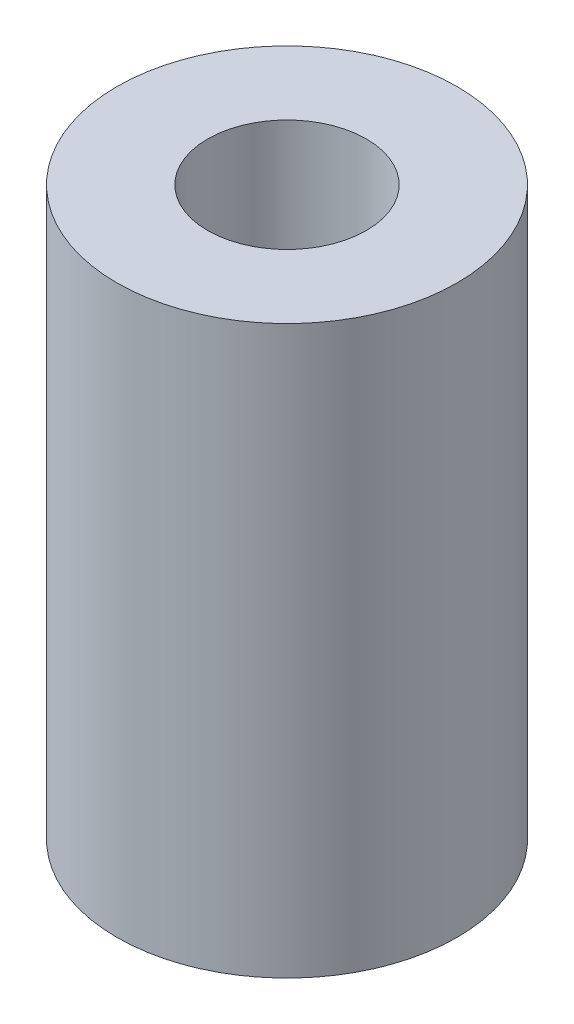
ISO-10303-21;
HEADER;
FILE_DESCRIPTION(('STEP AP214'),'2;1');
FILE_NAME('part.step','',(''),(''),'','','');
FILE_SCHEMA(('AUTOMOTIVE_DESIGN { 1 0 10303 214 1 1 1 1 }'));
ENDSEC;
DATA;
#1=APPLICATION_CONTEXT('core data for automotive mechanical design processes');
#2=APPLICATION_PROTOCOL_DEFINITION('international standard','automotive_design',2000,#1);
#3=PRODUCT_CONTEXT('',#1,'mechanical');
#4=PRODUCT('Part','Part','',(#3));
#5=PRODUCT_RELATED_PRODUCT_CATEGORY('part','',(#4));
#6=PRODUCT_DEFINITION_FORMATION('','',#4);
#7=PRODUCT_DEFINITION_CONTEXT('part definition',#1,'design');
#8=PRODUCT_DEFINITION('design','',#6,#7);
#9=PRODUCT_DEFINITION_SHAPE('','',#8);
#10=(LENGTH_UNIT() NAMED_UNIT(*) SI_UNIT(.MILLI.,.METRE.));
#11=(NAMED_UNIT(*) PLANE_ANGLE_UNIT() SI_UNIT($,.RADIAN.));
#12=(NAMED_UNIT(*) SI_UNIT($,.STERADIAN.) SOLID_ANGLE_UNIT());
#13=UNCERTAINTY_MEASURE_WITH_UNIT(LENGTH_MEASURE(1.E-05),#10,'distance_accuracy_value','');
#14=(GEOMETRIC_REPRESENTATION_CONTEXT(3) GLOBAL_UNCERTAINTY_ASSIGNED_CONTEXT((#13)) GLOBAL_UNIT_ASSIGNED_CONTEXT((#10,
#11,#12)) REPRESENTATION_CONTEXT('',''));
#15=CARTESIAN_POINT('',(0.,0.,0.));
#16=DIRECTION('',(0.,0.,1.));
#17=DIRECTION('',(1.,0.,0.));
#18=AXIS2_PLACEMENT_3D('',#15,#16,#17);
#19=CARTESIAN_POINT('',(0.,10.,0.));
#20=DIRECTION('',(0.,1.,0.));
#21=DIRECTION('',(0.,0.,1.));
#22=AXIS2_PLACEMENT_3D('',#19,#20,#21);
#23=PLANE('',#22);
#24=CARTESIAN_POINT('',(0.,10.,0.));
#25=DIRECTION('',(0.,1.,0.));
#26=DIRECTION('',(0.,0.,1.));
#27=AXIS2_PLACEMENT_3D('',#24,#25,#26);
#28=CIRCLE('',#27,3.);
#29=CARTESIAN_POINT('',(0.,10.,3.));
#30=VERTEX_POINT('',#29);
#31=EDGE_CURVE('E10',#30,#30,#28,.T.);
#32=ORIENTED_EDGE('',*,*,#31,.T.);
#33=EDGE_LOOP('',(#32));
#34=FACE_BOUND('',#33,.T.);
#35=CARTESIAN_POINT('',(0.,10.,0.));
#36=DIRECTION('',(0.,1.,0.));
#37=DIRECTION('',(0.,0.,1.));
#38=AXIS2_PLACEMENT_3D('',#35,#36,#37);
#39=CIRCLE('',#38,1.4);
#40=CARTESIAN_POINT('',(0.,10.,1.4));
#41=VERTEX_POINT('',#40);
#42=EDGE_CURVE('E42',#41,#41,#39,.T.);
#43=ORIENTED_EDGE('',*,*,#42,.F.);
#44=EDGE_LOOP('',(#43));
#45=FACE_BOUND('',#44,.T.);
#46=ADVANCED_FACE('F31',(#34,#45),#23,.T.);
#47=CARTESIAN_POINT('',(0.,0.,0.));
#48=DIRECTION('',(0.,1.,0.));
#49=DIRECTION('',(0.,0.,1.));
#50=AXIS2_PLACEMENT_3D('',#47,#48,#49);
#51=PLANE('',#50);
#52=CARTESIAN_POINT('',(0.,0.,0.));
#53=DIRECTION('',(0.,1.,0.));
#54=DIRECTION('',(0.,0.,1.));
#55=AXIS2_PLACEMENT_3D('',#52,#53,#54);
#56=CIRCLE('',#55,3.);
#57=CARTESIAN_POINT('',(0.,0.,3.));
#58=VERTEX_POINT('',#57);
#59=EDGE_CURVE('E35',#58,#58,#56,.T.);
#60=ORIENTED_EDGE('',*,*,#59,.F.);
#61=EDGE_LOOP('',(#60));
#62=FACE_BOUND('',#61,.T.);
#63=CARTESIAN_POINT('',(0.,0.,0.));
#64=DIRECTION('',(0.,1.,0.));
#65=DIRECTION('',(0.,0.,1.));
#66=AXIS2_PLACEMENT_3D('',#63,#64,#65);
#67=CIRCLE('',#66,1.4);
#68=CARTESIAN_POINT('',(0.,0.,1.4));
#69=VERTEX_POINT('',#68);
#70=EDGE_CURVE('E44',#69,#69,#67,.T.);
#71=ORIENTED_EDGE('',*,*,#70,.T.);
#72=EDGE_LOOP('',(#71));
#73=FACE_BOUND('',#72,.T.);
#74=ADVANCED_FACE('F54',(#62,#73),#51,.F.);
#75=CARTESIAN_POINT('',(0.,10.,0.));
#76=DIRECTION('',(0.,-1.,0.));
#77=DIRECTION('',(0.,0.,-1.));
#78=AXIS2_PLACEMENT_3D('',#75,#76,#77);
#79=CYLINDRICAL_SURFACE('',#78,3.);
#80=ORIENTED_EDGE('',*,*,#31,.F.);
#81=EDGE_LOOP('',(#80));
#82=FACE_BOUND('',#81,.T.);
#83=ORIENTED_EDGE('',*,*,#59,.T.);
#84=EDGE_LOOP('',(#83));
#85=FACE_BOUND('',#84,.T.);
#86=ADVANCED_FACE('F33',(#82,#85),#79,.T.);
#87=CARTESIAN_POINT('',(0.,10.,0.));
#88=DIRECTION('',(0.,-1.,0.));
#89=DIRECTION('',(0.,0.,-1.));
#90=AXIS2_PLACEMENT_3D('',#87,#88,#89);
#91=CYLINDRICAL_SURFACE('',#90,1.4);
#92=ORIENTED_EDGE('',*,*,#42,.T.);
#93=EDGE_LOOP('',(#92));
#94=FACE_BOUND('',#93,.T.);
#95=ORIENTED_EDGE('',*,*,#70,.F.);
#96=EDGE_LOOP('',(#95));
#97=FACE_BOUND('',#96,.T.);
#98=ADVANCED_FACE('F50',(#94,#97),#91,.F.);
#99=CLOSED_SHELL('',(#46,#74,#86,#98));
#100=MANIFOLD_SOLID_BREP('B2',#99);
#101=ADVANCED_BREP_SHAPE_REPRESENTATION('',(#18,#100),#14);
#102=SHAPE_DEFINITION_REPRESENTATION(#9,#101);
ENDSEC;
END-ISO-10303-21;
